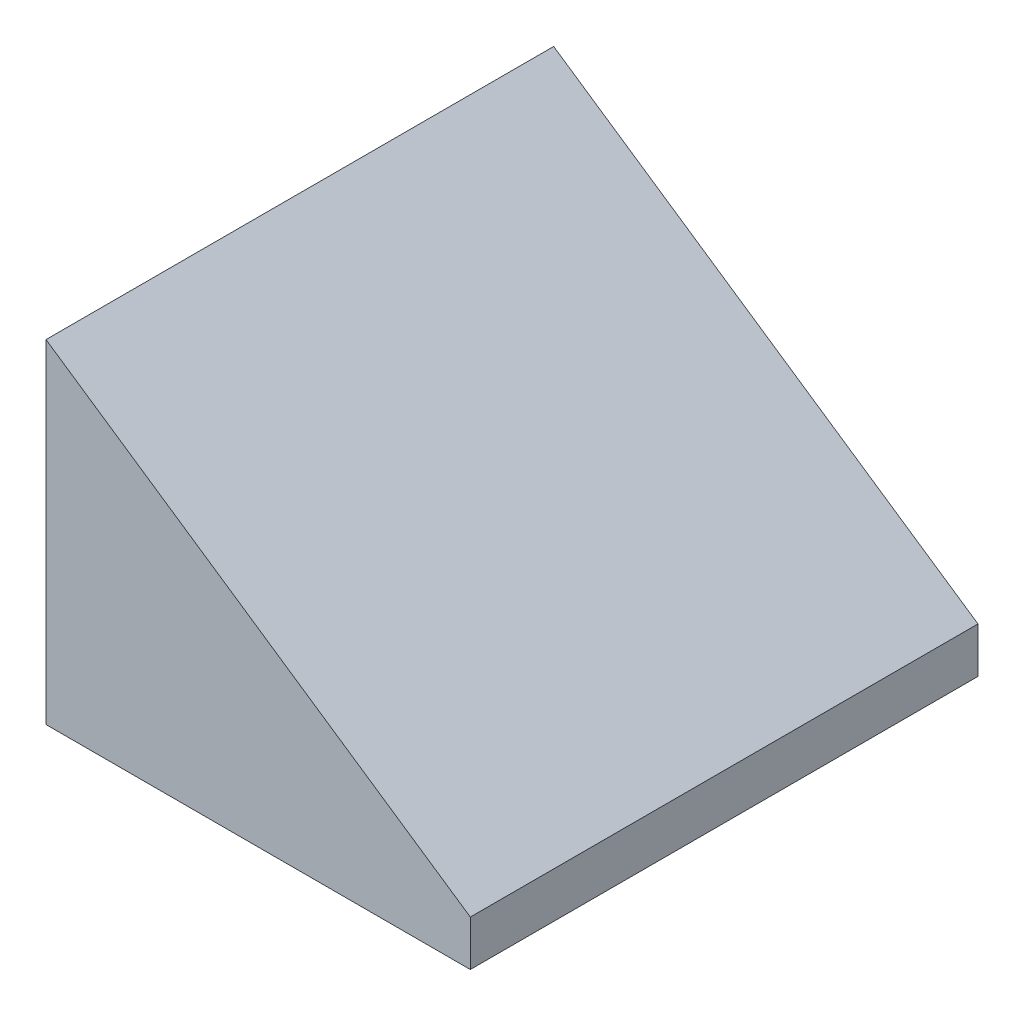
ISO-10303-21;
HEADER;
FILE_DESCRIPTION(('STEP AP214'),'2;1');
FILE_NAME('part.step','',(''),(''),'','','');
FILE_SCHEMA(('AUTOMOTIVE_DESIGN { 1 0 10303 214 1 1 1 1 }'));
ENDSEC;
DATA;
#1=APPLICATION_CONTEXT('core data for automotive mechanical design processes');
#2=APPLICATION_PROTOCOL_DEFINITION('international standard','automotive_design',2000,#1);
#3=PRODUCT_CONTEXT('',#1,'mechanical');
#4=PRODUCT('Part','Part','',(#3));
#5=PRODUCT_RELATED_PRODUCT_CATEGORY('part','',(#4));
#6=PRODUCT_DEFINITION_FORMATION('','',#4);
#7=PRODUCT_DEFINITION_CONTEXT('part definition',#1,'design');
#8=PRODUCT_DEFINITION('design','',#6,#7);
#9=PRODUCT_DEFINITION_SHAPE('','',#8);
#10=(LENGTH_UNIT() NAMED_UNIT(*) SI_UNIT(.MILLI.,.METRE.));
#11=(NAMED_UNIT(*) PLANE_ANGLE_UNIT() SI_UNIT($,.RADIAN.));
#12=(NAMED_UNIT(*) SI_UNIT($,.STERADIAN.) SOLID_ANGLE_UNIT());
#13=UNCERTAINTY_MEASURE_WITH_UNIT(LENGTH_MEASURE(1.E-05),#10,'distance_accuracy_value','');
#14=(GEOMETRIC_REPRESENTATION_CONTEXT(3) GLOBAL_UNCERTAINTY_ASSIGNED_CONTEXT((#13)) GLOBAL_UNIT_ASSIGNED_CONTEXT((#10,
#11,#12)) REPRESENTATION_CONTEXT('',''));
#15=CARTESIAN_POINT('',(0.,0.,0.));
#16=DIRECTION('',(0.,0.,1.));
#17=DIRECTION('',(1.,0.,0.));
#18=AXIS2_PLACEMENT_3D('',#15,#16,#17);
#19=CARTESIAN_POINT('',(-14.,22.,16.75));
#20=DIRECTION('',(1.,0.,0.));
#21=DIRECTION('',(0.,0.,-1.));
#22=AXIS2_PLACEMENT_3D('',#19,#20,#21);
#23=PLANE('',#22);
#24=DIRECTION('',(0.,0.,1.));
#25=VECTOR('',#24,1.);
#26=CARTESIAN_POINT('',(-14.,0.,16.75));
#27=LINE('',#26,#25);
#28=CARTESIAN_POINT('',(-14.,0.,-16.75));
#29=VERTEX_POINT('',#28);
#30=CARTESIAN_POINT('',(-14.,0.,16.75));
#31=VERTEX_POINT('',#30);
#32=EDGE_CURVE('E94',#29,#31,#27,.T.);
#33=ORIENTED_EDGE('',*,*,#32,.T.);
#34=DIRECTION('',(0.,-1.,0.));
#35=VECTOR('',#34,1.);
#36=CARTESIAN_POINT('',(-14.,22.,16.75));
#37=LINE('',#36,#35);
#38=CARTESIAN_POINT('',(-14.,22.,16.75));
#39=VERTEX_POINT('',#38);
#40=EDGE_CURVE('E11',#39,#31,#37,.T.);
#41=ORIENTED_EDGE('',*,*,#40,.F.);
#42=DIRECTION('',(0.,0.,1.));
#43=VECTOR('',#42,1.);
#44=CARTESIAN_POINT('',(-14.,22.,16.75));
#45=LINE('',#44,#43);
#46=CARTESIAN_POINT('',(-14.,22.,-16.75));
#47=VERTEX_POINT('',#46);
#48=EDGE_CURVE('E96',#47,#39,#45,.T.);
#49=ORIENTED_EDGE('',*,*,#48,.F.);
#50=DIRECTION('',(0.,-1.,0.));
#51=VECTOR('',#50,1.);
#52=CARTESIAN_POINT('',(-14.,22.,-16.75));
#53=LINE('',#52,#51);
#54=EDGE_CURVE('E80',#47,#29,#53,.T.);
#55=ORIENTED_EDGE('',*,*,#54,.T.);
#56=EDGE_LOOP('',(#33,#41,#49,#55));
#57=FACE_BOUND('',#56,.T.);
#58=ADVANCED_FACE('F39',(#57),#23,.F.);
#59=CARTESIAN_POINT('',(14.,22.,16.75));
#60=DIRECTION('',(0.,0.,-1.));
#61=DIRECTION('',(-1.,0.,0.));
#62=AXIS2_PLACEMENT_3D('',#59,#60,#61);
#63=PLANE('',#62);
#64=DIRECTION('',(0.,-1.,0.));
#65=VECTOR('',#64,1.);
#66=CARTESIAN_POINT('',(14.,22.,16.75));
#67=LINE('',#66,#65);
#68=CARTESIAN_POINT('',(14.,3.,16.75));
#69=VERTEX_POINT('',#68);
#70=CARTESIAN_POINT('',(14.,0.,16.75));
#71=VERTEX_POINT('',#70);
#72=EDGE_CURVE('E48',#69,#71,#67,.T.);
#73=ORIENTED_EDGE('',*,*,#72,.F.);
#74=DIRECTION('',(0.827475774391758,-0.561501418337265,0.));
#75=VECTOR('',#74,1.);
#76=CARTESIAN_POINT('',(5.80786026200874,8.55895196506551,16.75));
#77=LINE('',#76,#75);
#78=EDGE_CURVE('E112',#39,#69,#77,.T.);
#79=ORIENTED_EDGE('',*,*,#78,.F.);
#80=ORIENTED_EDGE('',*,*,#40,.T.);
#81=DIRECTION('',(1.,0.,0.));
#82=VECTOR('',#81,1.);
#83=CARTESIAN_POINT('',(14.,0.,16.75));
#84=LINE('',#83,#82);
#85=EDGE_CURVE('E89',#31,#71,#84,.T.);
#86=ORIENTED_EDGE('',*,*,#85,.T.);
#87=EDGE_LOOP('',(#73,#79,#80,#86));
#88=FACE_BOUND('',#87,.T.);
#89=ADVANCED_FACE('F115',(#88),#63,.F.);
#90=CARTESIAN_POINT('',(14.,22.,16.75));
#91=DIRECTION('',(-1.,0.,0.));
#92=DIRECTION('',(0.,0.,1.));
#93=AXIS2_PLACEMENT_3D('',#90,#91,#92);
#94=PLANE('',#93);
#95=DIRECTION('',(0.,-1.,0.));
#96=VECTOR('',#95,1.);
#97=CARTESIAN_POINT('',(14.,22.,-16.75));
#98=LINE('',#97,#96);
#99=CARTESIAN_POINT('',(14.,3.,-16.75));
#100=VERTEX_POINT('',#99);
#101=CARTESIAN_POINT('',(14.,0.,-16.75));
#102=VERTEX_POINT('',#101);
#103=EDGE_CURVE('E71',#100,#102,#98,.T.);
#104=ORIENTED_EDGE('',*,*,#103,.F.);
#105=DIRECTION('',(0.,0.,1.));
#106=VECTOR('',#105,1.);
#107=CARTESIAN_POINT('',(14.,3.,-27.25));
#108=LINE('',#107,#106);
#109=EDGE_CURVE('E117',#100,#69,#108,.T.);
#110=ORIENTED_EDGE('',*,*,#109,.T.);
#111=ORIENTED_EDGE('',*,*,#72,.T.);
#112=DIRECTION('',(0.,0.,-1.));
#113=VECTOR('',#112,1.);
#114=CARTESIAN_POINT('',(14.,0.,16.75));
#115=LINE('',#114,#113);
#116=EDGE_CURVE('E83',#71,#102,#115,.T.);
#117=ORIENTED_EDGE('',*,*,#116,.T.);
#118=EDGE_LOOP('',(#104,#110,#111,#117));
#119=FACE_BOUND('',#118,.T.);
#120=ADVANCED_FACE('F84',(#119),#94,.F.);
#121=CARTESIAN_POINT('',(14.,22.,-16.75));
#122=DIRECTION('',(0.,0.,1.));
#123=DIRECTION('',(1.,0.,0.));
#124=AXIS2_PLACEMENT_3D('',#121,#122,#123);
#125=PLANE('',#124);
#126=ORIENTED_EDGE('',*,*,#54,.F.);
#127=DIRECTION('',(0.827475774391758,-0.561501418337265,0.));
#128=VECTOR('',#127,1.);
#129=CARTESIAN_POINT('',(5.17205240174673,8.99039301310044,-16.75));
#130=LINE('',#129,#128);
#131=EDGE_CURVE('E55',#47,#100,#130,.T.);
#132=ORIENTED_EDGE('',*,*,#131,.T.);
#133=ORIENTED_EDGE('',*,*,#103,.T.);
#134=DIRECTION('',(-1.,0.,0.));
#135=VECTOR('',#134,1.);
#136=CARTESIAN_POINT('',(14.,0.,-16.75));
#137=LINE('',#136,#135);
#138=EDGE_CURVE('E75',#102,#29,#137,.T.);
#139=ORIENTED_EDGE('',*,*,#138,.T.);
#140=EDGE_LOOP('',(#126,#132,#133,#139));
#141=FACE_BOUND('',#140,.T.);
#142=ADVANCED_FACE('F73',(#141),#125,.F.);
#143=CARTESIAN_POINT('',(0.,0.,0.));
#144=DIRECTION('',(0.,1.,0.));
#145=DIRECTION('',(0.,0.,1.));
#146=AXIS2_PLACEMENT_3D('',#143,#144,#145);
#147=PLANE('',#146);
#148=ORIENTED_EDGE('',*,*,#32,.F.);
#149=ORIENTED_EDGE('',*,*,#138,.F.);
#150=ORIENTED_EDGE('',*,*,#116,.F.);
#151=ORIENTED_EDGE('',*,*,#85,.F.);
#152=EDGE_LOOP('',(#148,#149,#150,#151));
#153=FACE_BOUND('',#152,.T.);
#154=ADVANCED_FACE('F92',(#153),#147,.F.);
#155=CARTESIAN_POINT('',(5.80786026200874,8.55895196506551,-27.25));
#156=DIRECTION('',(-0.561501418337265,-0.827475774391759,0.));
#157=DIRECTION('',(0.827475774391758,-0.561501418337265,0.));
#158=AXIS2_PLACEMENT_3D('',#155,#156,#157);
#159=PLANE('',#158);
#160=ORIENTED_EDGE('',*,*,#48,.T.);
#161=ORIENTED_EDGE('',*,*,#78,.T.);
#162=ORIENTED_EDGE('',*,*,#109,.F.);
#163=ORIENTED_EDGE('',*,*,#131,.F.);
#164=EDGE_LOOP('',(#160,#161,#162,#163));
#165=FACE_BOUND('',#164,.T.);
#166=ADVANCED_FACE('F110',(#165),#159,.F.);
#167=CLOSED_SHELL('',(#58,#89,#120,#142,#154,#166));
#168=MANIFOLD_SOLID_BREP('B2',#167);
#169=ADVANCED_BREP_SHAPE_REPRESENTATION('',(#18,#168),#14);
#170=SHAPE_DEFINITION_REPRESENTATION(#9,#169);
ENDSEC;
END-ISO-10303-21;
